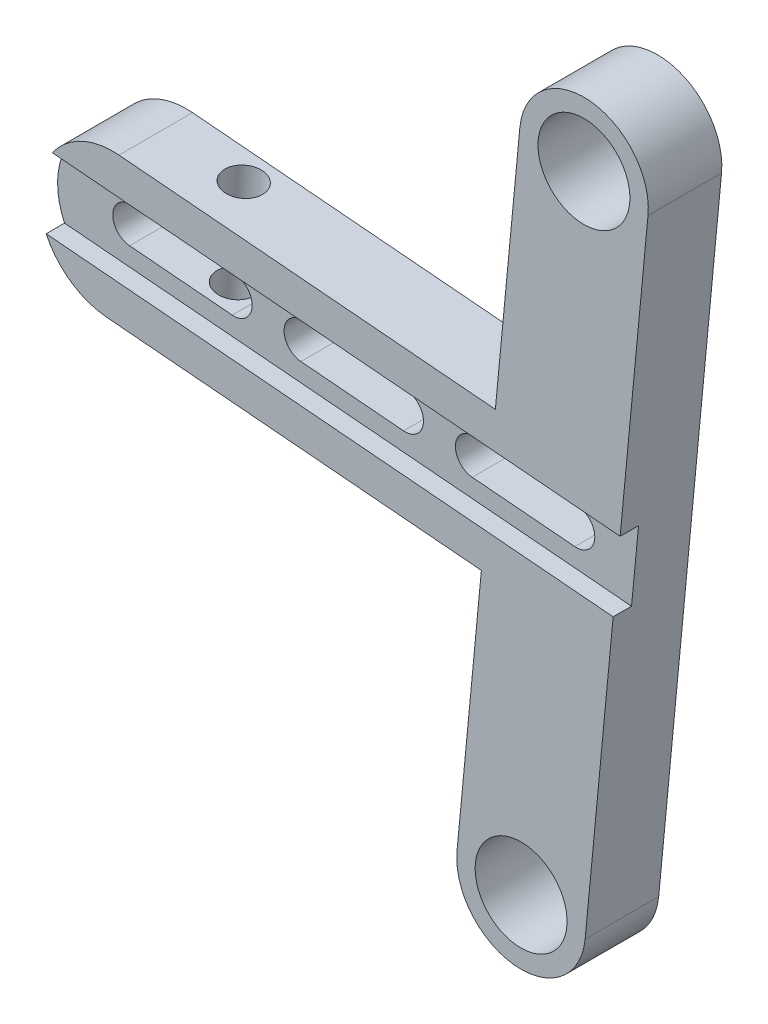
ISO-10303-21;
HEADER;
FILE_DESCRIPTION(('STEP AP214'),'2;1');
FILE_NAME('part.step','',(''),(''),'','','');
FILE_SCHEMA(('AUTOMOTIVE_DESIGN { 1 0 10303 214 1 1 1 1 }'));
ENDSEC;
DATA;
#1=APPLICATION_CONTEXT('core data for automotive mechanical design processes');
#2=APPLICATION_PROTOCOL_DEFINITION('international standard','automotive_design',2000,#1);
#3=PRODUCT_CONTEXT('',#1,'mechanical');
#4=PRODUCT('Part','Part','',(#3));
#5=PRODUCT_RELATED_PRODUCT_CATEGORY('part','',(#4));
#6=PRODUCT_DEFINITION_FORMATION('','',#4);
#7=PRODUCT_DEFINITION_CONTEXT('part definition',#1,'design');
#8=PRODUCT_DEFINITION('design','',#6,#7);
#9=PRODUCT_DEFINITION_SHAPE('','',#8);
#10=(LENGTH_UNIT() NAMED_UNIT(*) SI_UNIT(.MILLI.,.METRE.));
#11=(NAMED_UNIT(*) PLANE_ANGLE_UNIT() SI_UNIT($,.RADIAN.));
#12=(NAMED_UNIT(*) SI_UNIT($,.STERADIAN.) SOLID_ANGLE_UNIT());
#13=UNCERTAINTY_MEASURE_WITH_UNIT(LENGTH_MEASURE(1.E-05),#10,'distance_accuracy_value','');
#14=(GEOMETRIC_REPRESENTATION_CONTEXT(3) GLOBAL_UNCERTAINTY_ASSIGNED_CONTEXT((#13)) GLOBAL_UNIT_ASSIGNED_CONTEXT((#10,
#11,#12)) REPRESENTATION_CONTEXT('',''));
#15=CARTESIAN_POINT('',(0.,0.,0.));
#16=DIRECTION('',(0.,0.,1.));
#17=DIRECTION('',(1.,0.,0.));
#18=AXIS2_PLACEMENT_3D('',#15,#16,#17);
#19=CARTESIAN_POINT('',(-134.17279772922,67.0847083716752,12.7));
#20=DIRECTION('',(0.,0.,-1.));
#21=DIRECTION('',(-1.,0.,0.));
#22=AXIS2_PLACEMENT_3D('',#19,#20,#21);
#23=PLANE('',#22);
#24=CARTESIAN_POINT('',(-134.17279772922,67.0847083716752,12.7));
#25=DIRECTION('',(0.,0.,-1.));
#26=DIRECTION('',(-1.,0.,0.));
#27=AXIS2_PLACEMENT_3D('',#24,#25,#26);
#28=CIRCLE('',#27,3.96874999999999);
#29=CARTESIAN_POINT('',(-138.14154772922,67.0847083716752,12.7));
#30=VERTEX_POINT('',#29);
#31=EDGE_CURVE('E309',#30,#30,#28,.T.);
#32=ORIENTED_EDGE('',*,*,#31,.T.);
#33=EDGE_LOOP('',(#32));
#34=FACE_BOUND('',#33,.T.);
#35=DIRECTION('',(0.0950868612184537,0.99546897933769,0.));
#36=VECTOR('',#35,1.);
#37=CARTESIAN_POINT('',(-128.641723212775,66.5563819990302,12.7));
#38=LINE('',#37,#36);
#39=CARTESIAN_POINT('',(-128.641723212775,66.5563819990302,12.7));
#40=VERTEX_POINT('',#39);
#41=CARTESIAN_POINT('',(-126.225198192784,91.8551000802629,12.7));
#42=VERTEX_POINT('',#41);
#43=EDGE_CURVE('E343',#40,#42,#38,.T.);
#44=ORIENTED_EDGE('',*,*,#43,.T.);
#45=DIRECTION('',(-0.996395335560612,0.0848312163832154,0.));
#46=VECTOR('',#45,1.);
#47=CARTESIAN_POINT('',(-132.021876169662,92.3486182915698,12.7));
#48=LINE('',#47,#46);
#49=CARTESIAN_POINT('',(-175.171236239776,96.0222732859959,12.7));
#50=VERTEX_POINT('',#49);
#51=EDGE_CURVE('E52',#42,#50,#48,.T.);
#52=ORIENTED_EDGE('',*,*,#51,.T.);
#53=CARTESIAN_POINT('',(-169.42245880543,98.7193194499224,12.7));
#54=DIRECTION('',(0.,0.,1.));
#55=DIRECTION('',(1.,0.,0.));
#56=AXIS2_PLACEMENT_3D('',#53,#54,#55);
#57=CIRCLE('',#56,6.34999999999999);
#58=CARTESIAN_POINT('',(-169.961137029463,92.3922090691125,12.7));
#59=VERTEX_POINT('',#58);
#60=EDGE_CURVE('E352',#50,#59,#57,.T.);
#61=ORIENTED_EDGE('',*,*,#60,.T.);
#62=DIRECTION('',(0.996395335560612,-0.0848312163832143,0.));
#63=VECTOR('',#62,1.);
#64=CARTESIAN_POINT('',(-137.600145222711,89.6370553662006,12.7));
#65=LINE('',#64,#63);
#66=CARTESIAN_POINT('',(-137.600145222711,89.6370553662006,12.7));
#67=VERTEX_POINT('',#66);
#68=EDGE_CURVE('E356',#59,#67,#65,.T.);
#69=ORIENTED_EDGE('',*,*,#68,.T.);
#70=DIRECTION('',(-0.0950868612184541,-0.99546897933769,0.));
#71=VECTOR('',#70,1.);
#72=CARTESIAN_POINT('',(-139.703872245665,67.6130347443202,12.7));
#73=LINE('',#72,#71);
#74=CARTESIAN_POINT('',(-139.703872245665,67.6130347443202,12.7));
#75=VERTEX_POINT('',#74);
#76=EDGE_CURVE('E358',#67,#75,#73,.T.);
#77=ORIENTED_EDGE('',*,*,#76,.T.);
#78=CARTESIAN_POINT('',(-134.17279772922,67.0847083716752,12.7));
#79=DIRECTION('',(0.,0.,1.));
#80=DIRECTION('',(-1.,0.,0.));
#81=AXIS2_PLACEMENT_3D('',#78,#79,#80);
#82=CIRCLE('',#81,5.55625000000001);
#83=EDGE_CURVE('E338',#75,#40,#82,.T.);
#84=ORIENTED_EDGE('',*,*,#83,.T.);
#85=EDGE_LOOP('',(#44,#52,#61,#69,#77,#84));
#86=FACE_BOUND('',#85,.T.);
#87=ADVANCED_FACE('F43',(#34,#86),#23,.F.);
#88=CARTESIAN_POINT('',(-134.17279772922,67.0847083716752,12.7));
#89=DIRECTION('',(0.,0.,-1.));
#90=DIRECTION('',(-1.,0.,0.));
#91=AXIS2_PLACEMENT_3D('',#88,#89,#90);
#92=CYLINDRICAL_SURFACE('',#91,5.55625000000001);
#93=CARTESIAN_POINT('',(-134.17279772922,67.0847083716752,6.35));
#94=DIRECTION('',(0.,0.,1.));
#95=DIRECTION('',(-1.,0.,0.));
#96=AXIS2_PLACEMENT_3D('',#93,#94,#95);
#97=CIRCLE('',#96,5.55625000000001);
#98=CARTESIAN_POINT('',(-139.703872245665,67.6130347443202,6.35));
#99=VERTEX_POINT('',#98);
#100=CARTESIAN_POINT('',(-128.641723212775,66.5563819990302,6.35));
#101=VERTEX_POINT('',#100);
#102=EDGE_CURVE('E337',#99,#101,#97,.T.);
#103=ORIENTED_EDGE('',*,*,#102,.T.);
#104=DIRECTION('',(0.,0.,-1.));
#105=VECTOR('',#104,1.);
#106=CARTESIAN_POINT('',(-128.641723212775,66.5563819990302,12.7));
#107=LINE('',#106,#105);
#108=EDGE_CURVE('E396',#40,#101,#107,.T.);
#109=ORIENTED_EDGE('',*,*,#108,.F.);
#110=ORIENTED_EDGE('',*,*,#83,.F.);
#111=DIRECTION('',(0.,0.,-1.));
#112=VECTOR('',#111,1.);
#113=CARTESIAN_POINT('',(-139.703872245665,67.6130347443202,12.7));
#114=LINE('',#113,#112);
#115=EDGE_CURVE('E360',#75,#99,#114,.T.);
#116=ORIENTED_EDGE('',*,*,#115,.T.);
#117=EDGE_LOOP('',(#103,#109,#110,#116));
#118=FACE_BOUND('',#117,.T.);
#119=ADVANCED_FACE('F45',(#118),#92,.T.);
#120=CARTESIAN_POINT('',(-128.641723212775,66.5563819990302,12.7));
#121=DIRECTION('',(-0.99546897933769,0.0950868612184537,0.));
#122=DIRECTION('',(-0.0950868612184537,-0.99546897933769,0.));
#123=AXIS2_PLACEMENT_3D('',#120,#121,#122);
#124=PLANE('',#123);
#125=DIRECTION('',(-0.0950868612184537,-0.99546897933769,0.));
#126=VECTOR('',#125,1.);
#127=CARTESIAN_POINT('',(-128.641723212775,66.5563819990302,11.1125));
#128=LINE('',#127,#126);
#129=CARTESIAN_POINT('',(-125.621364609881,98.1766632569164,11.1125));
#130=VERTEX_POINT('',#129);
#131=CARTESIAN_POINT('',(-126.225198192784,91.8551000802629,11.1125));
#132=VERTEX_POINT('',#131);
#133=EDGE_CURVE('E334',#130,#132,#128,.T.);
#134=ORIENTED_EDGE('',*,*,#133,.T.);
#135=DIRECTION('',(0.,0.,1.));
#136=VECTOR('',#135,1.);
#137=CARTESIAN_POINT('',(-126.225198192784,91.8551000802629,12.7));
#138=LINE('',#137,#136);
#139=EDGE_CURVE('E331',#132,#42,#138,.T.);
#140=ORIENTED_EDGE('',*,*,#139,.T.);
#141=ORIENTED_EDGE('',*,*,#43,.F.);
#142=ORIENTED_EDGE('',*,*,#108,.T.);
#143=DIRECTION('',(0.0950868612184537,0.99546897933769,0.));
#144=VECTOR('',#143,1.);
#145=CARTESIAN_POINT('',(-128.641723212775,66.5563819990302,6.35));
#146=LINE('',#145,#144);
#147=CARTESIAN_POINT('',(-123.215720795475,123.361465467124,6.35));
#148=VERTEX_POINT('',#147);
#149=EDGE_CURVE('E363',#101,#148,#146,.T.);
#150=ORIENTED_EDGE('',*,*,#149,.T.);
#151=DIRECTION('',(0.,0.,-1.));
#152=VECTOR('',#151,1.);
#153=CARTESIAN_POINT('',(-123.215720795475,123.361465467124,12.7));
#154=LINE('',#153,#152);
#155=CARTESIAN_POINT('',(-123.215720795475,123.361465467124,12.7));
#156=VERTEX_POINT('',#155);
#157=EDGE_CURVE('E393',#156,#148,#154,.T.);
#158=ORIENTED_EDGE('',*,*,#157,.F.);
#159=CARTESIAN_POINT('',(-125.621364609881,98.1766632569164,12.7));
#160=VERTEX_POINT('',#159);
#161=EDGE_CURVE('E341',#160,#156,#38,.T.);
#162=ORIENTED_EDGE('',*,*,#161,.F.);
#163=DIRECTION('',(0.,0.,-1.));
#164=VECTOR('',#163,1.);
#165=CARTESIAN_POINT('',(-125.621364609881,98.1766632569164,12.7));
#166=LINE('',#165,#164);
#167=EDGE_CURVE('E325',#160,#130,#166,.T.);
#168=ORIENTED_EDGE('',*,*,#167,.T.);
#169=EDGE_LOOP('',(#134,#140,#141,#142,#150,#158,#162,#168));
#170=FACE_BOUND('',#169,.T.);
#171=ADVANCED_FACE('F456',(#170),#124,.F.);
#172=CARTESIAN_POINT('',(-128.74679531192,123.889791839769,12.7));
#173=DIRECTION('',(0.,0.,-1.));
#174=DIRECTION('',(-1.,0.,0.));
#175=AXIS2_PLACEMENT_3D('',#172,#173,#174);
#176=CYLINDRICAL_SURFACE('',#175,5.55625);
#177=CARTESIAN_POINT('',(-128.74679531192,123.889791839769,6.35));
#178=DIRECTION('',(0.,0.,1.));
#179=DIRECTION('',(1.,0.,0.));
#180=AXIS2_PLACEMENT_3D('',#177,#178,#179);
#181=CIRCLE('',#180,5.55625);
#182=CARTESIAN_POINT('',(-134.277869828365,124.418118212414,6.35));
#183=VERTEX_POINT('',#182);
#184=EDGE_CURVE('E365',#148,#183,#181,.T.);
#185=ORIENTED_EDGE('',*,*,#184,.T.);
#186=DIRECTION('',(0.,0.,-1.));
#187=VECTOR('',#186,1.);
#188=CARTESIAN_POINT('',(-134.277869828365,124.418118212414,12.7));
#189=LINE('',#188,#187);
#190=CARTESIAN_POINT('',(-134.277869828365,124.418118212414,12.7));
#191=VERTEX_POINT('',#190);
#192=EDGE_CURVE('E390',#191,#183,#189,.T.);
#193=ORIENTED_EDGE('',*,*,#192,.F.);
#194=CARTESIAN_POINT('',(-128.74679531192,123.889791839769,12.7));
#195=DIRECTION('',(0.,0.,1.));
#196=DIRECTION('',(1.,0.,0.));
#197=AXIS2_PLACEMENT_3D('',#194,#195,#196);
#198=CIRCLE('',#197,5.55625);
#199=EDGE_CURVE('E346',#156,#191,#198,.T.);
#200=ORIENTED_EDGE('',*,*,#199,.F.);
#201=ORIENTED_EDGE('',*,*,#157,.T.);
#202=EDGE_LOOP('',(#185,#193,#200,#201));
#203=FACE_BOUND('',#202,.T.);
#204=ADVANCED_FACE('F451',(#203),#176,.T.);
#205=CARTESIAN_POINT('',(-136.392478056906,102.280181719508,12.7));
#206=DIRECTION('',(0.99546897933769,-0.0950868612184534,0.));
#207=DIRECTION('',(0.0950868612184534,0.99546897933769,0.));
#208=AXIS2_PLACEMENT_3D('',#205,#206,#207);
#209=PLANE('',#208);
#210=DIRECTION('',(-0.0950868612184534,-0.99546897933769,0.));
#211=VECTOR('',#210,1.);
#212=CARTESIAN_POINT('',(-136.392478056906,102.280181719508,6.35));
#213=LINE('',#212,#211);
#214=CARTESIAN_POINT('',(-136.392478056906,102.280181719508,6.35));
#215=VERTEX_POINT('',#214);
#216=EDGE_CURVE('E367',#183,#215,#213,.T.);
#217=ORIENTED_EDGE('',*,*,#216,.T.);
#218=DIRECTION('',(0.,0.,-1.));
#219=VECTOR('',#218,1.);
#220=CARTESIAN_POINT('',(-136.392478056906,102.280181719508,12.7));
#221=LINE('',#220,#219);
#222=CARTESIAN_POINT('',(-136.392478056906,102.280181719508,12.7));
#223=VERTEX_POINT('',#222);
#224=EDGE_CURVE('E387',#223,#215,#221,.T.);
#225=ORIENTED_EDGE('',*,*,#224,.F.);
#226=DIRECTION('',(-0.0950868612184534,-0.99546897933769,0.));
#227=VECTOR('',#226,1.);
#228=CARTESIAN_POINT('',(-136.392478056906,102.280181719508,12.7));
#229=LINE('',#228,#227);
#230=EDGE_CURVE('E348',#191,#223,#229,.T.);
#231=ORIENTED_EDGE('',*,*,#230,.F.);
#232=ORIENTED_EDGE('',*,*,#192,.T.);
#233=EDGE_LOOP('',(#217,#225,#231,#232));
#234=FACE_BOUND('',#233,.T.);
#235=ADVANCED_FACE('F448',(#234),#209,.F.);
#236=CARTESIAN_POINT('',(-136.392478056906,102.280181719508,12.7));
#237=DIRECTION('',(-0.0848312163832146,-0.996395335560612,0.));
#238=DIRECTION('',(0.996395335560612,-0.0848312163832146,0.));
#239=AXIS2_PLACEMENT_3D('',#236,#237,#238);
#240=PLANE('',#239);
#241=CARTESIAN_POINT('',(-162.083382416195,104.467456778917,8.73124999999901));
#242=DIRECTION('',(-0.0848312163832146,-0.996395335560612,0.));
#243=DIRECTION('',(0.996395335560612,-0.0848312163832146,0.));
#244=AXIS2_PLACEMENT_3D('',#241,#242,#243);
#245=CIRCLE('',#244,1.63194999999974);
#246=CARTESIAN_POINT('',(-160.457315048327,104.32901647534,8.73124999999901));
#247=VERTEX_POINT('',#246);
#248=EDGE_CURVE('E234',#247,#247,#245,.T.);
#249=ORIENTED_EDGE('',*,*,#248,.T.);
#250=EDGE_LOOP('',(#249));
#251=FACE_BOUND('',#250,.T.);
#252=DIRECTION('',(-0.996395335560612,0.0848312163832146,0.));
#253=VECTOR('',#252,1.);
#254=CARTESIAN_POINT('',(-136.392478056906,102.280181719508,6.35));
#255=LINE('',#254,#253);
#256=CARTESIAN_POINT('',(-168.883780581396,105.046429830732,6.35));
#257=VERTEX_POINT('',#256);
#258=EDGE_CURVE('E369',#215,#257,#255,.T.);
#259=ORIENTED_EDGE('',*,*,#258,.T.);
#260=DIRECTION('',(0.,0.,-1.));
#261=VECTOR('',#260,1.);
#262=CARTESIAN_POINT('',(-168.883780581396,105.046429830732,12.7));
#263=LINE('',#262,#261);
#264=CARTESIAN_POINT('',(-168.883780581396,105.046429830732,12.7));
#265=VERTEX_POINT('',#264);
#266=EDGE_CURVE('E384',#265,#257,#263,.T.);
#267=ORIENTED_EDGE('',*,*,#266,.F.);
#268=DIRECTION('',(-0.996395335560612,0.0848312163832146,0.));
#269=VECTOR('',#268,1.);
#270=CARTESIAN_POINT('',(-136.392478056906,102.280181719508,12.7));
#271=LINE('',#270,#269);
#272=EDGE_CURVE('E350',#223,#265,#271,.T.);
#273=ORIENTED_EDGE('',*,*,#272,.F.);
#274=ORIENTED_EDGE('',*,*,#224,.T.);
#275=EDGE_LOOP('',(#259,#267,#273,#274));
#276=FACE_BOUND('',#275,.T.);
#277=ADVANCED_FACE('F444',(#251,#276),#240,.F.);
#278=CARTESIAN_POINT('',(-169.42245880543,98.7193194499224,12.7));
#279=DIRECTION('',(0.,0.,-1.));
#280=DIRECTION('',(-1.,0.,0.));
#281=AXIS2_PLACEMENT_3D('',#278,#279,#280);
#282=CYLINDRICAL_SURFACE('',#281,6.34999999999999);
#283=ORIENTED_EDGE('',*,*,#60,.F.);
#284=DIRECTION('',(0.,0.,-1.));
#285=VECTOR('',#284,1.);
#286=CARTESIAN_POINT('',(-175.171236239776,96.0222732859959,12.7));
#287=LINE('',#286,#285);
#288=CARTESIAN_POINT('',(-175.171236239776,96.0222732859959,11.1125));
#289=VERTEX_POINT('',#288);
#290=EDGE_CURVE('E328',#50,#289,#287,.T.);
#291=ORIENTED_EDGE('',*,*,#290,.T.);
#292=CARTESIAN_POINT('',(-169.42245880543,98.7193194499224,11.1125));
#293=DIRECTION('',(0.,0.,-1.));
#294=DIRECTION('',(-1.,0.,0.));
#295=AXIS2_PLACEMENT_3D('',#292,#293,#294);
#296=CIRCLE('',#295,6.34999999999999);
#297=CARTESIAN_POINT('',(-174.632558015742,102.349383666806,11.1125));
#298=VERTEX_POINT('',#297);
#299=EDGE_CURVE('E11',#289,#298,#296,.T.);
#300=ORIENTED_EDGE('',*,*,#299,.T.);
#301=DIRECTION('',(0.,0.,-1.));
#302=VECTOR('',#301,1.);
#303=CARTESIAN_POINT('',(-174.632558015742,102.349383666806,12.7));
#304=LINE('',#303,#302);
#305=CARTESIAN_POINT('',(-174.632558015742,102.349383666806,12.7));
#306=VERTEX_POINT('',#305);
#307=EDGE_CURVE('E322',#298,#306,#304,.F.);
#308=ORIENTED_EDGE('',*,*,#307,.T.);
#309=EDGE_CURVE('E353',#265,#306,#57,.T.);
#310=ORIENTED_EDGE('',*,*,#309,.F.);
#311=ORIENTED_EDGE('',*,*,#266,.T.);
#312=CARTESIAN_POINT('',(-169.42245880543,98.7193194499224,6.35));
#313=DIRECTION('',(0.,0.,1.));
#314=DIRECTION('',(1.,0.,0.));
#315=AXIS2_PLACEMENT_3D('',#312,#313,#314);
#316=CIRCLE('',#315,6.34999999999999);
#317=CARTESIAN_POINT('',(-169.961137029463,92.3922090691125,6.35));
#318=VERTEX_POINT('',#317);
#319=EDGE_CURVE('E371',#257,#318,#316,.T.);
#320=ORIENTED_EDGE('',*,*,#319,.T.);
#321=DIRECTION('',(0.,0.,-1.));
#322=VECTOR('',#321,1.);
#323=CARTESIAN_POINT('',(-169.961137029463,92.3922090691125,12.7));
#324=LINE('',#323,#322);
#325=EDGE_CURVE('E381',#59,#318,#324,.T.);
#326=ORIENTED_EDGE('',*,*,#325,.F.);
#327=EDGE_LOOP('',(#283,#291,#300,#308,#310,#311,#320,#326));
#328=FACE_BOUND('',#327,.T.);
#329=ADVANCED_FACE('F439',(#328),#282,.T.);
#330=CARTESIAN_POINT('',(-137.600145222711,89.6370553662006,12.7));
#331=DIRECTION('',(0.0848312163832143,0.996395335560612,0.));
#332=DIRECTION('',(-0.996395335560612,0.0848312163832143,0.));
#333=AXIS2_PLACEMENT_3D('',#330,#331,#332);
#334=PLANE('',#333);
#335=CARTESIAN_POINT('',(-163.160738864261,91.8132360172971,8.73124999999901));
#336=DIRECTION('',(-0.0848312163832144,-0.996395335560612,0.));
#337=DIRECTION('',(0.996395335560612,-0.0848312163832144,0.));
#338=AXIS2_PLACEMENT_3D('',#335,#336,#337);
#339=CIRCLE('',#338,1.63194999999974);
#340=CARTESIAN_POINT('',(-161.534671496394,91.6747957137205,8.73124999999901));
#341=VERTEX_POINT('',#340);
#342=EDGE_CURVE('E703',#341,#341,#339,.T.);
#343=ORIENTED_EDGE('',*,*,#342,.F.);
#344=EDGE_LOOP('',(#343));
#345=FACE_BOUND('',#344,.T.);
#346=DIRECTION('',(0.996395335560612,-0.0848312163832143,0.));
#347=VECTOR('',#346,1.);
#348=CARTESIAN_POINT('',(-137.600145222711,89.6370553662006,6.35));
#349=LINE('',#348,#347);
#350=CARTESIAN_POINT('',(-137.600145222711,89.6370553662006,6.35));
#351=VERTEX_POINT('',#350);
#352=EDGE_CURVE('E373',#318,#351,#349,.T.);
#353=ORIENTED_EDGE('',*,*,#352,.T.);
#354=DIRECTION('',(0.,0.,-1.));
#355=VECTOR('',#354,1.);
#356=CARTESIAN_POINT('',(-137.600145222711,89.6370553662006,12.7));
#357=LINE('',#356,#355);
#358=EDGE_CURVE('E378',#67,#351,#357,.T.);
#359=ORIENTED_EDGE('',*,*,#358,.F.);
#360=ORIENTED_EDGE('',*,*,#68,.F.);
#361=ORIENTED_EDGE('',*,*,#325,.T.);
#362=EDGE_LOOP('',(#353,#359,#360,#361));
#363=FACE_BOUND('',#362,.T.);
#364=ADVANCED_FACE('F432',(#345,#363),#334,.F.);
#365=CARTESIAN_POINT('',(-139.703872245665,67.6130347443202,12.7));
#366=DIRECTION('',(0.99546897933769,-0.0950868612184541,0.));
#367=DIRECTION('',(0.0950868612184541,0.99546897933769,0.));
#368=AXIS2_PLACEMENT_3D('',#365,#366,#367);
#369=PLANE('',#368);
#370=DIRECTION('',(-0.0950868612184541,-0.99546897933769,0.));
#371=VECTOR('',#370,1.);
#372=CARTESIAN_POINT('',(-139.703872245665,67.6130347443202,6.35));
#373=LINE('',#372,#371);
#374=EDGE_CURVE('E342',#351,#99,#373,.T.);
#375=ORIENTED_EDGE('',*,*,#374,.T.);
#376=ORIENTED_EDGE('',*,*,#115,.F.);
#377=ORIENTED_EDGE('',*,*,#76,.F.);
#378=ORIENTED_EDGE('',*,*,#358,.T.);
#379=EDGE_LOOP('',(#375,#376,#377,#378));
#380=FACE_BOUND('',#379,.T.);
#381=ADVANCED_FACE('F428',(#380),#369,.F.);
#382=CARTESIAN_POINT('',(-128.74679531192,123.889791839769,12.7));
#383=DIRECTION('',(0.,0.,-1.));
#384=DIRECTION('',(-1.,0.,0.));
#385=AXIS2_PLACEMENT_3D('',#382,#383,#384);
#386=CIRCLE('',#385,3.96874999999999);
#387=CARTESIAN_POINT('',(-132.71554531192,123.889791839769,12.7));
#388=VERTEX_POINT('',#387);
#389=EDGE_CURVE('E312',#388,#388,#386,.T.);
#390=ORIENTED_EDGE('',*,*,#389,.T.);
#391=EDGE_LOOP('',(#390));
#392=FACE_BOUND('',#391,.T.);
#393=ORIENTED_EDGE('',*,*,#309,.T.);
#394=DIRECTION('',(0.996395335560612,-0.0848312163832154,0.));
#395=VECTOR('',#394,1.);
#396=CARTESIAN_POINT('',(-131.483197945628,98.6757286723796,12.7));
#397=LINE('',#396,#395);
#398=EDGE_CURVE('E399',#306,#160,#397,.T.);
#399=ORIENTED_EDGE('',*,*,#398,.T.);
#400=ORIENTED_EDGE('',*,*,#161,.T.);
#401=ORIENTED_EDGE('',*,*,#199,.T.);
#402=ORIENTED_EDGE('',*,*,#230,.T.);
#403=ORIENTED_EDGE('',*,*,#272,.T.);
#404=EDGE_LOOP('',(#393,#399,#400,#401,#402,#403));
#405=FACE_BOUND('',#404,.T.);
#406=ADVANCED_FACE('F414',(#392,#405),#23,.F.);
#407=CARTESIAN_POINT('',(-134.17279772922,67.0847083716752,6.35));
#408=DIRECTION('',(0.,0.,-1.));
#409=DIRECTION('',(-1.,0.,0.));
#410=AXIS2_PLACEMENT_3D('',#407,#408,#409);
#411=PLANE('',#410);
#412=CARTESIAN_POINT('',(-145.774736989138,96.705997092046,6.35));
#413=DIRECTION('',(0.,0.,1.));
#414=DIRECTION('',(1.,0.,0.));
#415=AXIS2_PLACEMENT_3D('',#412,#413,#414);
#416=CIRCLE('',#415,1.58750000000001);
#417=CARTESIAN_POINT('',(-145.909406545146,95.1242194968435,6.35));
#418=VERTEX_POINT('',#417);
#419=CARTESIAN_POINT('',(-145.64006743313,98.2877746872485,6.35));
#420=VERTEX_POINT('',#419);
#421=EDGE_CURVE('E210',#418,#420,#416,.T.);
#422=ORIENTED_EDGE('',*,*,#421,.T.);
#423=DIRECTION('',(-0.996395335560612,0.0848312163832125,0.));
#424=VECTOR('',#423,1.);
#425=CARTESIAN_POINT('',(-145.64006743313,98.2877746872485,6.35));
#426=LINE('',#425,#424);
#427=CARTESIAN_POINT('',(-154.498021966263,99.0419242008953,6.35));
#428=VERTEX_POINT('',#427);
#429=EDGE_CURVE('E221',#420,#428,#426,.T.);
#430=ORIENTED_EDGE('',*,*,#429,.T.);
#431=CARTESIAN_POINT('',(-154.632691522272,97.4601466056928,6.35));
#432=DIRECTION('',(0.,0.,1.));
#433=DIRECTION('',(1.,0.,0.));
#434=AXIS2_PLACEMENT_3D('',#431,#432,#433);
#435=CIRCLE('',#434,1.58749999999999);
#436=CARTESIAN_POINT('',(-154.76736107828,95.8783690104903,6.35));
#437=VERTEX_POINT('',#436);
#438=EDGE_CURVE('E60',#428,#437,#435,.T.);
#439=ORIENTED_EDGE('',*,*,#438,.T.);
#440=DIRECTION('',(0.996395335560612,-0.0848312163832172,0.));
#441=VECTOR('',#440,1.);
#442=CARTESIAN_POINT('',(-145.909406545146,95.1242194968435,6.35));
#443=LINE('',#442,#441);
#444=EDGE_CURVE('E218',#437,#418,#443,.T.);
#445=ORIENTED_EDGE('',*,*,#444,.T.);
#446=EDGE_LOOP('',(#422,#430,#439,#445));
#447=FACE_BOUND('',#446,.T.);
#448=CARTESIAN_POINT('',(-130.98496970598,95.4468242478164,6.35));
#449=DIRECTION('',(0.,0.,1.));
#450=DIRECTION('',(1.,0.,0.));
#451=AXIS2_PLACEMENT_3D('',#448,#449,#450);
#452=CIRCLE('',#451,1.58750000000001);
#453=CARTESIAN_POINT('',(-131.119639261988,93.8650466526139,6.35));
#454=VERTEX_POINT('',#453);
#455=CARTESIAN_POINT('',(-130.850300149972,97.0286018430189,6.35));
#456=VERTEX_POINT('',#455);
#457=EDGE_CURVE('E251',#454,#456,#452,.T.);
#458=ORIENTED_EDGE('',*,*,#457,.T.);
#459=DIRECTION('',(-0.996395335560612,0.0848312163832125,0.));
#460=VECTOR('',#459,1.);
#461=CARTESIAN_POINT('',(-130.850300149972,97.0286018430189,6.35));
#462=LINE('',#461,#460);
#463=CARTESIAN_POINT('',(-139.708254683106,97.7827513566657,6.35));
#464=VERTEX_POINT('',#463);
#465=EDGE_CURVE('E254',#456,#464,#462,.T.);
#466=ORIENTED_EDGE('',*,*,#465,.T.);
#467=CARTESIAN_POINT('',(-139.842924239114,96.2009737614632,6.35));
#468=DIRECTION('',(0.,0.,1.));
#469=DIRECTION('',(1.,0.,0.));
#470=AXIS2_PLACEMENT_3D('',#467,#468,#469);
#471=CIRCLE('',#470,1.58749999999999);
#472=CARTESIAN_POINT('',(-139.977593795122,94.6191961662607,6.35));
#473=VERTEX_POINT('',#472);
#474=EDGE_CURVE('E68',#464,#473,#471,.T.);
#475=ORIENTED_EDGE('',*,*,#474,.T.);
#476=DIRECTION('',(0.996395335560612,-0.0848312163832172,0.));
#477=VECTOR('',#476,1.);
#478=CARTESIAN_POINT('',(-131.119639261988,93.8650466526139,6.35));
#479=LINE('',#478,#477);
#480=EDGE_CURVE('E259',#473,#454,#479,.T.);
#481=ORIENTED_EDGE('',*,*,#480,.T.);
#482=EDGE_LOOP('',(#458,#466,#475,#481));
#483=FACE_BOUND('',#482,.T.);
#484=CARTESIAN_POINT('',(-160.564504272296,97.9651699362756,6.35));
#485=DIRECTION('',(0.,0.,-1.));
#486=DIRECTION('',(-1.,0.,0.));
#487=AXIS2_PLACEMENT_3D('',#484,#485,#486);
#488=CIRCLE('',#487,1.58750000000001);
#489=CARTESIAN_POINT('',(-160.429834716287,99.5469475314781,6.35));
#490=VERTEX_POINT('',#489);
#491=CARTESIAN_POINT('',(-160.699173828304,96.3833923410731,6.35));
#492=VERTEX_POINT('',#491);
#493=EDGE_CURVE('E306',#490,#492,#488,.T.);
#494=ORIENTED_EDGE('',*,*,#493,.F.);
#495=DIRECTION('',(0.996395335560612,-0.0848312163832125,0.));
#496=VECTOR('',#495,1.);
#497=CARTESIAN_POINT('',(-131.617867501637,97.0939510771773,6.35));
#498=LINE('',#497,#496);
#499=CARTESIAN_POINT('',(-169.287789249421,100.301097045125,6.35));
#500=VERTEX_POINT('',#499);
#501=EDGE_CURVE('E293',#500,#490,#498,.T.);
#502=ORIENTED_EDGE('',*,*,#501,.F.);
#503=CARTESIAN_POINT('',(-169.42245880543,98.7193194499224,6.35));
#504=DIRECTION('',(0.,0.,-1.));
#505=DIRECTION('',(-1.,0.,0.));
#506=AXIS2_PLACEMENT_3D('',#503,#504,#505);
#507=CIRCLE('',#506,1.58749999999999);
#508=CARTESIAN_POINT('',(-169.557128361438,97.1375418547199,6.35));
#509=VERTEX_POINT('',#508);
#510=EDGE_CURVE('E301',#509,#500,#507,.T.);
#511=ORIENTED_EDGE('',*,*,#510,.F.);
#512=DIRECTION('',(-0.996395335560612,0.0848312163832172,0.));
#513=VECTOR('',#512,1.);
#514=CARTESIAN_POINT('',(-131.887206613653,93.9303958867722,6.35));
#515=LINE('',#514,#513);
#516=EDGE_CURVE('E304',#492,#509,#515,.T.);
#517=ORIENTED_EDGE('',*,*,#516,.F.);
#518=EDGE_LOOP('',(#494,#502,#511,#517));
#519=FACE_BOUND('',#518,.T.);
#520=CARTESIAN_POINT('',(-134.17279772922,67.0847083716752,6.35));
#521=DIRECTION('',(0.,0.,-1.));
#522=DIRECTION('',(-1.,0.,0.));
#523=AXIS2_PLACEMENT_3D('',#520,#521,#522);
#524=CIRCLE('',#523,3.96874999999999);
#525=CARTESIAN_POINT('',(-138.14154772922,67.0847083716752,6.35));
#526=VERTEX_POINT('',#525);
#527=EDGE_CURVE('E308',#526,#526,#524,.T.);
#528=ORIENTED_EDGE('',*,*,#527,.F.);
#529=EDGE_LOOP('',(#528));
#530=FACE_BOUND('',#529,.T.);
#531=CARTESIAN_POINT('',(-128.74679531192,123.889791839769,6.35));
#532=DIRECTION('',(0.,0.,-1.));
#533=DIRECTION('',(-1.,0.,0.));
#534=AXIS2_PLACEMENT_3D('',#531,#532,#533);
#535=CIRCLE('',#534,3.96874999999999);
#536=CARTESIAN_POINT('',(-132.71554531192,123.889791839769,6.35));
#537=VERTEX_POINT('',#536);
#538=EDGE_CURVE('E313',#537,#537,#535,.T.);
#539=ORIENTED_EDGE('',*,*,#538,.F.);
#540=EDGE_LOOP('',(#539));
#541=FACE_BOUND('',#540,.T.);
#542=ORIENTED_EDGE('',*,*,#102,.F.);
#543=ORIENTED_EDGE('',*,*,#374,.F.);
#544=ORIENTED_EDGE('',*,*,#352,.F.);
#545=ORIENTED_EDGE('',*,*,#319,.F.);
#546=ORIENTED_EDGE('',*,*,#258,.F.);
#547=ORIENTED_EDGE('',*,*,#216,.F.);
#548=ORIENTED_EDGE('',*,*,#184,.F.);
#549=ORIENTED_EDGE('',*,*,#149,.F.);
#550=EDGE_LOOP('',(#542,#543,#544,#545,#546,#547,#548,#549));
#551=FACE_BOUND('',#550,.T.);
#552=ADVANCED_FACE('F225',(#447,#483,#519,#530,#541,#551),#411,.T.);
#553=CARTESIAN_POINT('',(-112.478465378141,93.8712154336216,11.1125));
#554=DIRECTION('',(0.,0.,-1.));
#555=DIRECTION('',(-1.,0.,0.));
#556=AXIS2_PLACEMENT_3D('',#553,#554,#555);
#557=PLANE('',#556);
#558=DIRECTION('',(-0.996395335560612,0.0848312163832125,0.));
#559=VECTOR('',#558,1.);
#560=CARTESIAN_POINT('',(-145.64006743313,98.2877746872485,11.1125));
#561=LINE('',#560,#559);
#562=CARTESIAN_POINT('',(-145.64006743313,98.2877746872485,11.1125));
#563=VERTEX_POINT('',#562);
#564=CARTESIAN_POINT('',(-154.498021966263,99.0419242008953,11.1125));
#565=VERTEX_POINT('',#564);
#566=EDGE_CURVE('E240',#563,#565,#561,.T.);
#567=ORIENTED_EDGE('',*,*,#566,.F.);
#568=CARTESIAN_POINT('',(-145.774736989138,96.705997092046,11.1125));
#569=DIRECTION('',(0.,0.,1.));
#570=DIRECTION('',(1.,0.,0.));
#571=AXIS2_PLACEMENT_3D('',#568,#569,#570);
#572=CIRCLE('',#571,1.58750000000001);
#573=CARTESIAN_POINT('',(-145.909406545146,95.1242194968435,11.1125));
#574=VERTEX_POINT('',#573);
#575=EDGE_CURVE('E213',#574,#563,#572,.T.);
#576=ORIENTED_EDGE('',*,*,#575,.F.);
#577=DIRECTION('',(0.996395335560612,-0.0848312163832172,0.));
#578=VECTOR('',#577,1.);
#579=CARTESIAN_POINT('',(-145.909406545146,95.1242194968435,11.1125));
#580=LINE('',#579,#578);
#581=CARTESIAN_POINT('',(-154.76736107828,95.8783690104903,11.1125));
#582=VERTEX_POINT('',#581);
#583=EDGE_CURVE('E228',#582,#574,#580,.T.);
#584=ORIENTED_EDGE('',*,*,#583,.F.);
#585=CARTESIAN_POINT('',(-154.632691522272,97.4601466056928,11.1125));
#586=DIRECTION('',(0.,0.,1.));
#587=DIRECTION('',(1.,0.,0.));
#588=AXIS2_PLACEMENT_3D('',#585,#586,#587);
#589=CIRCLE('',#588,1.58749999999999);
#590=EDGE_CURVE('E231',#565,#582,#589,.T.);
#591=ORIENTED_EDGE('',*,*,#590,.F.);
#592=EDGE_LOOP('',(#567,#576,#584,#591));
#593=FACE_BOUND('',#592,.T.);
#594=DIRECTION('',(-0.996395335560612,0.0848312163832125,0.));
#595=VECTOR('',#594,1.);
#596=CARTESIAN_POINT('',(-130.850300149972,97.0286018430189,11.1125));
#597=LINE('',#596,#595);
#598=CARTESIAN_POINT('',(-130.850300149972,97.0286018430189,11.1125));
#599=VERTEX_POINT('',#598);
#600=CARTESIAN_POINT('',(-139.708254683106,97.7827513566656,11.1125));
#601=VERTEX_POINT('',#600);
#602=EDGE_CURVE('E265',#599,#601,#597,.T.);
#603=ORIENTED_EDGE('',*,*,#602,.F.);
#604=CARTESIAN_POINT('',(-130.98496970598,95.4468242478164,11.1125));
#605=DIRECTION('',(0.,0.,1.));
#606=DIRECTION('',(1.,0.,0.));
#607=AXIS2_PLACEMENT_3D('',#604,#605,#606);
#608=CIRCLE('',#607,1.58750000000001);
#609=CARTESIAN_POINT('',(-131.119639261988,93.8650466526139,11.1125));
#610=VERTEX_POINT('',#609);
#611=EDGE_CURVE('E263',#610,#599,#608,.T.);
#612=ORIENTED_EDGE('',*,*,#611,.F.);
#613=DIRECTION('',(0.996395335560612,-0.0848312163832172,0.));
#614=VECTOR('',#613,1.);
#615=CARTESIAN_POINT('',(-131.119639261988,93.8650466526139,11.1125));
#616=LINE('',#615,#614);
#617=CARTESIAN_POINT('',(-139.977593795122,94.6191961662607,11.1125));
#618=VERTEX_POINT('',#617);
#619=EDGE_CURVE('E255',#618,#610,#616,.T.);
#620=ORIENTED_EDGE('',*,*,#619,.F.);
#621=CARTESIAN_POINT('',(-139.842924239114,96.2009737614632,11.1125));
#622=DIRECTION('',(0.,0.,1.));
#623=DIRECTION('',(1.,0.,0.));
#624=AXIS2_PLACEMENT_3D('',#621,#622,#623);
#625=CIRCLE('',#624,1.58749999999999);
#626=EDGE_CURVE('E268',#601,#618,#625,.T.);
#627=ORIENTED_EDGE('',*,*,#626,.F.);
#628=EDGE_LOOP('',(#603,#612,#620,#627));
#629=FACE_BOUND('',#628,.T.);
#630=DIRECTION('',(-0.996395335560612,0.0848312163832125,0.));
#631=VECTOR('',#630,1.);
#632=CARTESIAN_POINT('',(-160.429834716287,99.5469475314781,11.1125));
#633=LINE('',#632,#631);
#634=CARTESIAN_POINT('',(-160.429834716287,99.5469475314781,11.1125));
#635=VERTEX_POINT('',#634);
#636=CARTESIAN_POINT('',(-169.287789249421,100.301097045125,11.1125));
#637=VERTEX_POINT('',#636);
#638=EDGE_CURVE('E281',#635,#637,#633,.T.);
#639=ORIENTED_EDGE('',*,*,#638,.F.);
#640=CARTESIAN_POINT('',(-160.564504272296,97.9651699362756,11.1125));
#641=DIRECTION('',(0.,0.,1.));
#642=DIRECTION('',(1.,0.,0.));
#643=AXIS2_PLACEMENT_3D('',#640,#641,#642);
#644=CIRCLE('',#643,1.58750000000001);
#645=CARTESIAN_POINT('',(-160.699173828304,96.3833923410731,11.1125));
#646=VERTEX_POINT('',#645);
#647=EDGE_CURVE('E247',#646,#635,#644,.T.);
#648=ORIENTED_EDGE('',*,*,#647,.F.);
#649=DIRECTION('',(0.996395335560612,-0.0848312163832172,0.));
#650=VECTOR('',#649,1.);
#651=CARTESIAN_POINT('',(-160.699173828304,96.3833923410731,11.1125));
#652=LINE('',#651,#650);
#653=CARTESIAN_POINT('',(-169.557128361438,97.1375418547199,11.1125));
#654=VERTEX_POINT('',#653);
#655=EDGE_CURVE('E287',#654,#646,#652,.T.);
#656=ORIENTED_EDGE('',*,*,#655,.F.);
#657=CARTESIAN_POINT('',(-169.42245880543,98.7193194499224,11.1125));
#658=DIRECTION('',(0.,0.,1.));
#659=DIRECTION('',(1.,0.,0.));
#660=AXIS2_PLACEMENT_3D('',#657,#658,#659);
#661=CIRCLE('',#660,1.58749999999999);
#662=EDGE_CURVE('E284',#637,#654,#661,.T.);
#663=ORIENTED_EDGE('',*,*,#662,.F.);
#664=EDGE_LOOP('',(#639,#648,#656,#663));
#665=FACE_BOUND('',#664,.T.);
#666=DIRECTION('',(-0.996395335560612,0.0848312163832154,0.));
#667=VECTOR('',#666,1.);
#668=CARTESIAN_POINT('',(-112.209126266124,97.0347706240266,11.1125));
#669=LINE('',#668,#667);
#670=EDGE_CURVE('E316',#130,#298,#669,.T.);
#671=ORIENTED_EDGE('',*,*,#670,.T.);
#672=ORIENTED_EDGE('',*,*,#299,.F.);
#673=DIRECTION('',(0.996395335560612,-0.0848312163832154,0.));
#674=VECTOR('',#673,1.);
#675=CARTESIAN_POINT('',(-112.747804490157,90.7076602432167,11.1125));
#676=LINE('',#675,#674);
#677=EDGE_CURVE('E319',#289,#132,#676,.T.);
#678=ORIENTED_EDGE('',*,*,#677,.T.);
#679=ORIENTED_EDGE('',*,*,#133,.F.);
#680=EDGE_LOOP('',(#671,#672,#678,#679));
#681=FACE_BOUND('',#680,.T.);
#682=ADVANCED_FACE('F413',(#593,#629,#665,#681),#557,.F.);
#683=CARTESIAN_POINT('',(-112.747804490157,90.7076602432167,11.1125));
#684=DIRECTION('',(-0.0848312163832154,-0.996395335560612,0.));
#685=DIRECTION('',(0.996395335560612,-0.0848312163832154,0.));
#686=AXIS2_PLACEMENT_3D('',#683,#684,#685);
#687=PLANE('',#686);
#688=ORIENTED_EDGE('',*,*,#677,.F.);
#689=ORIENTED_EDGE('',*,*,#290,.F.);
#690=ORIENTED_EDGE('',*,*,#51,.F.);
#691=ORIENTED_EDGE('',*,*,#139,.F.);
#692=EDGE_LOOP('',(#688,#689,#690,#691));
#693=FACE_BOUND('',#692,.T.);
#694=ADVANCED_FACE('F460',(#693),#687,.F.);
#695=CARTESIAN_POINT('',(-112.209126266124,97.0347706240266,11.1125));
#696=DIRECTION('',(0.0848312163832154,0.996395335560612,0.));
#697=DIRECTION('',(-0.996395335560612,0.0848312163832154,0.));
#698=AXIS2_PLACEMENT_3D('',#695,#696,#697);
#699=PLANE('',#698);
#700=ORIENTED_EDGE('',*,*,#398,.F.);
#701=ORIENTED_EDGE('',*,*,#307,.F.);
#702=ORIENTED_EDGE('',*,*,#670,.F.);
#703=ORIENTED_EDGE('',*,*,#167,.F.);
#704=EDGE_LOOP('',(#700,#701,#702,#703));
#705=FACE_BOUND('',#704,.T.);
#706=ADVANCED_FACE('F464',(#705),#699,.F.);
#707=CARTESIAN_POINT('',(-128.74679531192,123.889791839769,0.));
#708=DIRECTION('',(0.,0.,-1.));
#709=DIRECTION('',(-1.,0.,0.));
#710=AXIS2_PLACEMENT_3D('',#707,#708,#709);
#711=CYLINDRICAL_SURFACE('',#710,3.96874999999999);
#712=ORIENTED_EDGE('',*,*,#538,.T.);
#713=EDGE_LOOP('',(#712));
#714=FACE_BOUND('',#713,.T.);
#715=ORIENTED_EDGE('',*,*,#389,.F.);
#716=EDGE_LOOP('',(#715));
#717=FACE_BOUND('',#716,.T.);
#718=ADVANCED_FACE('F484',(#714,#717),#711,.F.);
#719=CARTESIAN_POINT('',(-134.17279772922,67.0847083716752,0.));
#720=DIRECTION('',(0.,0.,-1.));
#721=DIRECTION('',(-1.,0.,0.));
#722=AXIS2_PLACEMENT_3D('',#719,#720,#721);
#723=CYLINDRICAL_SURFACE('',#722,3.96874999999999);
#724=ORIENTED_EDGE('',*,*,#527,.T.);
#725=EDGE_LOOP('',(#724));
#726=FACE_BOUND('',#725,.T.);
#727=ORIENTED_EDGE('',*,*,#31,.F.);
#728=EDGE_LOOP('',(#727));
#729=FACE_BOUND('',#728,.T.);
#730=ADVANCED_FACE('F408',(#726,#729),#723,.F.);
#731=CARTESIAN_POINT('',(-160.564504272296,97.9651699362756,0.));
#732=DIRECTION('',(0.,0.,1.));
#733=DIRECTION('',(1.,0.,0.));
#734=AXIS2_PLACEMENT_3D('',#731,#732,#733);
#735=CYLINDRICAL_SURFACE('',#734,1.58750000000001);
#736=ORIENTED_EDGE('',*,*,#493,.T.);
#737=DIRECTION('',(0.,0.,1.));
#738=VECTOR('',#737,1.);
#739=CARTESIAN_POINT('',(-160.699173828304,96.3833923410731,0.));
#740=LINE('',#739,#738);
#741=EDGE_CURVE('E291',#492,#646,#740,.T.);
#742=ORIENTED_EDGE('',*,*,#741,.T.);
#743=ORIENTED_EDGE('',*,*,#647,.T.);
#744=DIRECTION('',(0.,0.,1.));
#745=VECTOR('',#744,1.);
#746=CARTESIAN_POINT('',(-160.429834716287,99.5469475314781,0.));
#747=LINE('',#746,#745);
#748=EDGE_CURVE('E290',#490,#635,#747,.T.);
#749=ORIENTED_EDGE('',*,*,#748,.F.);
#750=EDGE_LOOP('',(#736,#742,#743,#749));
#751=FACE_BOUND('',#750,.T.);
#752=ADVANCED_FACE('F483',(#751),#735,.F.);
#753=CARTESIAN_POINT('',(-160.699173828304,96.3833923410731,0.));
#754=DIRECTION('',(-0.0848312163832172,-0.996395335560612,0.));
#755=DIRECTION('',(0.996395335560612,-0.0848312163832172,0.));
#756=AXIS2_PLACEMENT_3D('',#753,#754,#755);
#757=PLANE('',#756);
#758=CARTESIAN_POINT('',(-162.756730196236,96.5585688029044,8.73124999999901));
#759=DIRECTION('',(-0.0848312163832172,-0.996395335560612,0.));
#760=DIRECTION('',(0.996395335560612,-0.0848312163832172,0.));
#761=AXIS2_PLACEMENT_3D('',#758,#759,#760);
#762=CIRCLE('',#761,1.63194999999974);
#763=CARTESIAN_POINT('',(-161.130662828369,96.4201284993279,8.73124999999901));
#764=VERTEX_POINT('',#763);
#765=EDGE_CURVE('E706',#764,#764,#762,.T.);
#766=ORIENTED_EDGE('',*,*,#765,.T.);
#767=EDGE_LOOP('',(#766));
#768=FACE_BOUND('',#767,.T.);
#769=ORIENTED_EDGE('',*,*,#516,.T.);
#770=DIRECTION('',(0.,0.,1.));
#771=VECTOR('',#770,1.);
#772=CARTESIAN_POINT('',(-169.557128361438,97.1375418547199,0.));
#773=LINE('',#772,#771);
#774=EDGE_CURVE('E294',#509,#654,#773,.T.);
#775=ORIENTED_EDGE('',*,*,#774,.T.);
#776=ORIENTED_EDGE('',*,*,#655,.T.);
#777=ORIENTED_EDGE('',*,*,#741,.F.);
#778=EDGE_LOOP('',(#769,#775,#776,#777));
#779=FACE_BOUND('',#778,.T.);
#780=ADVANCED_FACE('F491',(#768,#779),#757,.F.);
#781=CARTESIAN_POINT('',(-169.42245880543,98.7193194499224,0.));
#782=DIRECTION('',(0.,0.,1.));
#783=DIRECTION('',(1.,0.,0.));
#784=AXIS2_PLACEMENT_3D('',#781,#782,#783);
#785=CYLINDRICAL_SURFACE('',#784,1.58749999999999);
#786=ORIENTED_EDGE('',*,*,#510,.T.);
#787=DIRECTION('',(0.,0.,1.));
#788=VECTOR('',#787,1.);
#789=CARTESIAN_POINT('',(-169.287789249421,100.301097045125,0.));
#790=LINE('',#789,#788);
#791=EDGE_CURVE('E296',#500,#637,#790,.T.);
#792=ORIENTED_EDGE('',*,*,#791,.T.);
#793=ORIENTED_EDGE('',*,*,#662,.T.);
#794=ORIENTED_EDGE('',*,*,#774,.F.);
#795=EDGE_LOOP('',(#786,#792,#793,#794));
#796=FACE_BOUND('',#795,.T.);
#797=ADVANCED_FACE('F593',(#796),#785,.F.);
#798=CARTESIAN_POINT('',(-160.429834716287,99.5469475314781,0.));
#799=DIRECTION('',(0.0848312163832125,0.996395335560612,0.));
#800=DIRECTION('',(-0.996395335560612,0.0848312163832125,0.));
#801=AXIS2_PLACEMENT_3D('',#798,#799,#800);
#802=PLANE('',#801);
#803=CARTESIAN_POINT('',(-162.48739108422,99.7221239933094,8.73124999999901));
#804=DIRECTION('',(0.0848312163832125,0.996395335560612,0.));
#805=DIRECTION('',(-0.996395335560612,0.0848312163832125,0.));
#806=AXIS2_PLACEMENT_3D('',#803,#804,#805);
#807=CIRCLE('',#806,1.63194999999974);
#808=CARTESIAN_POINT('',(-164.113458452088,99.860564296886,8.73124999999901));
#809=VERTEX_POINT('',#808);
#810=EDGE_CURVE('E47',#809,#809,#807,.T.);
#811=ORIENTED_EDGE('',*,*,#810,.T.);
#812=EDGE_LOOP('',(#811));
#813=FACE_BOUND('',#812,.T.);
#814=ORIENTED_EDGE('',*,*,#501,.T.);
#815=ORIENTED_EDGE('',*,*,#748,.T.);
#816=ORIENTED_EDGE('',*,*,#638,.T.);
#817=ORIENTED_EDGE('',*,*,#791,.F.);
#818=EDGE_LOOP('',(#814,#815,#816,#817));
#819=FACE_BOUND('',#818,.T.);
#820=ADVANCED_FACE('F597',(#813,#819),#802,.F.);
#821=CARTESIAN_POINT('',(-130.98496970598,95.4468242478164,6.35));
#822=DIRECTION('',(0.,0.,1.));
#823=DIRECTION('',(1.,0.,0.));
#824=AXIS2_PLACEMENT_3D('',#821,#822,#823);
#825=CYLINDRICAL_SURFACE('',#824,1.58750000000001);
#826=ORIENTED_EDGE('',*,*,#611,.T.);
#827=DIRECTION('',(0.,0.,1.));
#828=VECTOR('',#827,1.);
#829=CARTESIAN_POINT('',(-130.850300149972,97.0286018430189,6.35));
#830=LINE('',#829,#828);
#831=EDGE_CURVE('E262',#456,#599,#830,.T.);
#832=ORIENTED_EDGE('',*,*,#831,.F.);
#833=ORIENTED_EDGE('',*,*,#457,.F.);
#834=DIRECTION('',(0.,0.,1.));
#835=VECTOR('',#834,1.);
#836=CARTESIAN_POINT('',(-131.119639261988,93.8650466526139,6.35));
#837=LINE('',#836,#835);
#838=EDGE_CURVE('E241',#454,#610,#837,.T.);
#839=ORIENTED_EDGE('',*,*,#838,.T.);
#840=EDGE_LOOP('',(#826,#832,#833,#839));
#841=FACE_BOUND('',#840,.T.);
#842=ADVANCED_FACE('F606',(#841),#825,.F.);
#843=CARTESIAN_POINT('',(-131.119639261988,93.8650466526139,6.35));
#844=DIRECTION('',(-0.0848312163832172,-0.996395335560612,0.));
#845=DIRECTION('',(0.996395335560612,-0.0848312163832172,0.));
#846=AXIS2_PLACEMENT_3D('',#843,#844,#845);
#847=PLANE('',#846);
#848=ORIENTED_EDGE('',*,*,#619,.T.);
#849=ORIENTED_EDGE('',*,*,#838,.F.);
#850=ORIENTED_EDGE('',*,*,#480,.F.);
#851=DIRECTION('',(0.,0.,1.));
#852=VECTOR('',#851,1.);
#853=CARTESIAN_POINT('',(-139.977593795122,94.6191961662607,6.35));
#854=LINE('',#853,#852);
#855=EDGE_CURVE('E274',#473,#618,#854,.T.);
#856=ORIENTED_EDGE('',*,*,#855,.T.);
#857=EDGE_LOOP('',(#848,#849,#850,#856));
#858=FACE_BOUND('',#857,.T.);
#859=ADVANCED_FACE('F625',(#858),#847,.F.);
#860=CARTESIAN_POINT('',(-139.842924239114,96.2009737614632,6.35));
#861=DIRECTION('',(0.,0.,1.));
#862=DIRECTION('',(1.,0.,0.));
#863=AXIS2_PLACEMENT_3D('',#860,#861,#862);
#864=CYLINDRICAL_SURFACE('',#863,1.58749999999999);
#865=ORIENTED_EDGE('',*,*,#626,.T.);
#866=ORIENTED_EDGE('',*,*,#855,.F.);
#867=ORIENTED_EDGE('',*,*,#474,.F.);
#868=DIRECTION('',(0.,0.,1.));
#869=VECTOR('',#868,1.);
#870=CARTESIAN_POINT('',(-139.708254683106,97.7827513566656,6.35));
#871=LINE('',#870,#869);
#872=EDGE_CURVE('E276',#464,#601,#871,.T.);
#873=ORIENTED_EDGE('',*,*,#872,.T.);
#874=EDGE_LOOP('',(#865,#866,#867,#873));
#875=FACE_BOUND('',#874,.T.);
#876=ADVANCED_FACE('F633',(#875),#864,.F.);
#877=CARTESIAN_POINT('',(-130.850300149972,97.0286018430189,6.35));
#878=DIRECTION('',(0.0848312163832125,0.996395335560612,0.));
#879=DIRECTION('',(-0.996395335560612,0.0848312163832125,0.));
#880=AXIS2_PLACEMENT_3D('',#877,#878,#879);
#881=PLANE('',#880);
#882=ORIENTED_EDGE('',*,*,#602,.T.);
#883=ORIENTED_EDGE('',*,*,#872,.F.);
#884=ORIENTED_EDGE('',*,*,#465,.F.);
#885=ORIENTED_EDGE('',*,*,#831,.T.);
#886=EDGE_LOOP('',(#882,#883,#884,#885));
#887=FACE_BOUND('',#886,.T.);
#888=ADVANCED_FACE('F641',(#887),#881,.F.);
#889=CARTESIAN_POINT('',(-145.774736989138,96.705997092046,6.35));
#890=DIRECTION('',(0.,0.,1.));
#891=DIRECTION('',(1.,0.,0.));
#892=AXIS2_PLACEMENT_3D('',#889,#890,#891);
#893=CYLINDRICAL_SURFACE('',#892,1.58750000000001);
#894=ORIENTED_EDGE('',*,*,#575,.T.);
#895=DIRECTION('',(0.,0.,1.));
#896=VECTOR('',#895,1.);
#897=CARTESIAN_POINT('',(-145.64006743313,98.2877746872485,6.35));
#898=LINE('',#897,#896);
#899=EDGE_CURVE('E206',#420,#563,#898,.T.);
#900=ORIENTED_EDGE('',*,*,#899,.F.);
#901=ORIENTED_EDGE('',*,*,#421,.F.);
#902=DIRECTION('',(0.,0.,1.));
#903=VECTOR('',#902,1.);
#904=CARTESIAN_POINT('',(-145.909406545146,95.1242194968435,6.35));
#905=LINE('',#904,#903);
#906=EDGE_CURVE('E245',#418,#574,#905,.T.);
#907=ORIENTED_EDGE('',*,*,#906,.T.);
#908=EDGE_LOOP('',(#894,#900,#901,#907));
#909=FACE_BOUND('',#908,.T.);
#910=ADVANCED_FACE('F208',(#909),#893,.F.);
#911=CARTESIAN_POINT('',(-145.909406545146,95.1242194968435,6.35));
#912=DIRECTION('',(-0.0848312163832172,-0.996395335560612,0.));
#913=DIRECTION('',(0.996395335560612,-0.0848312163832172,0.));
#914=AXIS2_PLACEMENT_3D('',#911,#912,#913);
#915=PLANE('',#914);
#916=ORIENTED_EDGE('',*,*,#583,.T.);
#917=ORIENTED_EDGE('',*,*,#906,.F.);
#918=ORIENTED_EDGE('',*,*,#444,.F.);
#919=DIRECTION('',(0.,0.,1.));
#920=VECTOR('',#919,1.);
#921=CARTESIAN_POINT('',(-154.76736107828,95.8783690104903,6.35));
#922=LINE('',#921,#920);
#923=EDGE_CURVE('E248',#437,#582,#922,.T.);
#924=ORIENTED_EDGE('',*,*,#923,.T.);
#925=EDGE_LOOP('',(#916,#917,#918,#924));
#926=FACE_BOUND('',#925,.T.);
#927=ADVANCED_FACE('F655',(#926),#915,.F.);
#928=CARTESIAN_POINT('',(-154.632691522272,97.4601466056928,6.35));
#929=DIRECTION('',(0.,0.,1.));
#930=DIRECTION('',(1.,0.,0.));
#931=AXIS2_PLACEMENT_3D('',#928,#929,#930);
#932=CYLINDRICAL_SURFACE('',#931,1.58749999999999);
#933=ORIENTED_EDGE('',*,*,#590,.T.);
#934=ORIENTED_EDGE('',*,*,#923,.F.);
#935=ORIENTED_EDGE('',*,*,#438,.F.);
#936=DIRECTION('',(0.,0.,1.));
#937=VECTOR('',#936,1.);
#938=CARTESIAN_POINT('',(-154.498021966263,99.0419242008953,6.35));
#939=LINE('',#938,#937);
#940=EDGE_CURVE('E217',#428,#565,#939,.T.);
#941=ORIENTED_EDGE('',*,*,#940,.T.);
#942=EDGE_LOOP('',(#933,#934,#935,#941));
#943=FACE_BOUND('',#942,.T.);
#944=ADVANCED_FACE('F662',(#943),#932,.F.);
#945=CARTESIAN_POINT('',(-145.64006743313,98.2877746872485,6.35));
#946=DIRECTION('',(0.0848312163832125,0.996395335560612,0.));
#947=DIRECTION('',(-0.996395335560612,0.0848312163832125,0.));
#948=AXIS2_PLACEMENT_3D('',#945,#946,#947);
#949=PLANE('',#948);
#950=ORIENTED_EDGE('',*,*,#566,.T.);
#951=ORIENTED_EDGE('',*,*,#940,.F.);
#952=ORIENTED_EDGE('',*,*,#429,.F.);
#953=ORIENTED_EDGE('',*,*,#899,.T.);
#954=EDGE_LOOP('',(#950,#951,#952,#953));
#955=FACE_BOUND('',#954,.T.);
#956=ADVANCED_FACE('F222',(#955),#949,.F.);
#957=CARTESIAN_POINT('',(-159.692170919722,132.553721281616,8.73124999999901));
#958=DIRECTION('',(-0.0848312163832144,-0.996395335560612,0.));
#959=DIRECTION('',(0.996395335560612,-0.0848312163832144,0.));
#960=AXIS2_PLACEMENT_3D('',#957,#958,#959);
#961=CYLINDRICAL_SURFACE('',#960,1.63194999999974);
#962=ORIENTED_EDGE('',*,*,#810,.F.);
#963=EDGE_LOOP('',(#962));
#964=FACE_BOUND('',#963,.T.);
#965=ORIENTED_EDGE('',*,*,#248,.F.);
#966=EDGE_LOOP('',(#965));
#967=FACE_BOUND('',#966,.T.);
#968=ADVANCED_FACE('F676',(#964,#967),#961,.F.);
#969=ORIENTED_EDGE('',*,*,#342,.T.);
#970=EDGE_LOOP('',(#969));
#971=FACE_BOUND('',#970,.T.);
#972=ORIENTED_EDGE('',*,*,#765,.F.);
#973=EDGE_LOOP('',(#972));
#974=FACE_BOUND('',#973,.T.);
#975=ADVANCED_FACE('F683',(#971,#974),#961,.F.);
#976=CLOSED_SHELL('',(#87,#119,#171,#204,#235,#277,#329,#364,#381,#406,#552,#682,#694,#706,#718,
#730,#752,#780,#797,#820,#842,#859,#876,#888,#910,#927,#944,#956,#968,#975));
#977=MANIFOLD_SOLID_BREP('B2',#976);
#978=ADVANCED_BREP_SHAPE_REPRESENTATION('',(#18,#977),#14);
#979=SHAPE_DEFINITION_REPRESENTATION(#9,#978);
ENDSEC;
END-ISO-10303-21;
